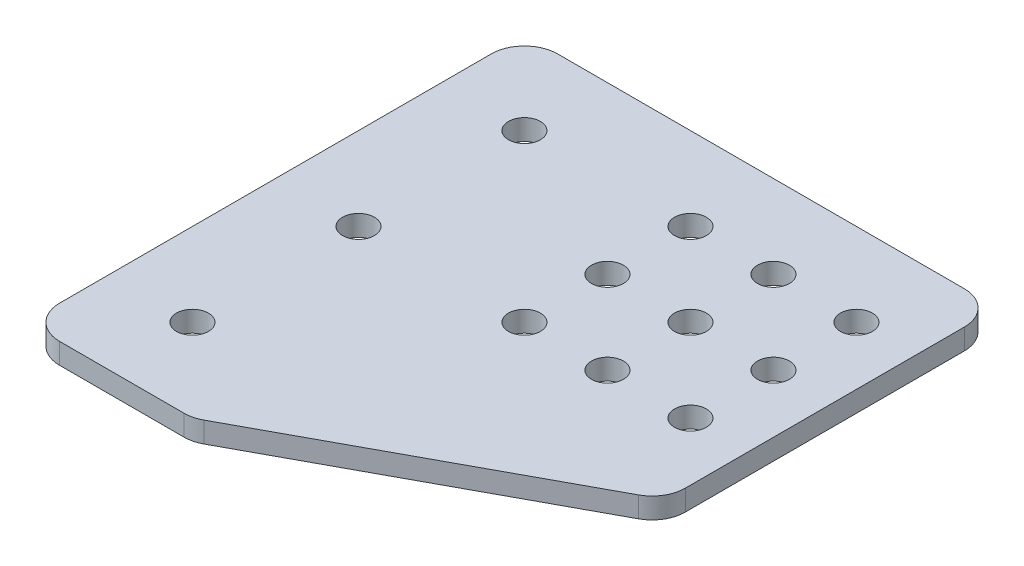
ISO-10303-21;
HEADER;
FILE_DESCRIPTION(('STEP AP214'),'2;1');
FILE_NAME('part.step','',(''),(''),'','','');
FILE_SCHEMA(('AUTOMOTIVE_DESIGN { 1 0 10303 214 1 1 1 1 }'));
ENDSEC;
DATA;
#1=APPLICATION_CONTEXT('core data for automotive mechanical design processes');
#2=APPLICATION_PROTOCOL_DEFINITION('international standard','automotive_design',2000,#1);
#3=PRODUCT_CONTEXT('',#1,'mechanical');
#4=PRODUCT('Part','Part','',(#3));
#5=PRODUCT_RELATED_PRODUCT_CATEGORY('part','',(#4));
#6=PRODUCT_DEFINITION_FORMATION('','',#4);
#7=PRODUCT_DEFINITION_CONTEXT('part definition',#1,'design');
#8=PRODUCT_DEFINITION('design','',#6,#7);
#9=PRODUCT_DEFINITION_SHAPE('','',#8);
#10=(LENGTH_UNIT() NAMED_UNIT(*) SI_UNIT(.MILLI.,.METRE.));
#11=(NAMED_UNIT(*) PLANE_ANGLE_UNIT() SI_UNIT($,.RADIAN.));
#12=(NAMED_UNIT(*) SI_UNIT($,.STERADIAN.) SOLID_ANGLE_UNIT());
#13=UNCERTAINTY_MEASURE_WITH_UNIT(LENGTH_MEASURE(1.E-05),#10,'distance_accuracy_value','');
#14=(GEOMETRIC_REPRESENTATION_CONTEXT(3) GLOBAL_UNCERTAINTY_ASSIGNED_CONTEXT((#13)) GLOBAL_UNIT_ASSIGNED_CONTEXT((#10,
#11,#12)) REPRESENTATION_CONTEXT('',''));
#15=CARTESIAN_POINT('',(0.,0.,0.));
#16=DIRECTION('',(0.,0.,1.));
#17=DIRECTION('',(1.,0.,0.));
#18=AXIS2_PLACEMENT_3D('',#15,#16,#17);
#19=CARTESIAN_POINT('',(0.,3.175,0.));
#20=DIRECTION('',(1.,0.,0.));
#21=DIRECTION('',(0.,0.,-1.));
#22=AXIS2_PLACEMENT_3D('',#19,#20,#21);
#23=PLANE('',#22);
#24=DIRECTION('',(0.,0.,1.));
#25=VECTOR('',#24,1.);
#26=CARTESIAN_POINT('',(0.,0.,0.));
#27=LINE('',#26,#25);
#28=CARTESIAN_POINT('',(0.,0.,5.08000000000004));
#29=VERTEX_POINT('',#28);
#30=CARTESIAN_POINT('',(0.,0.,71.12));
#31=VERTEX_POINT('',#30);
#32=EDGE_CURVE('E146',#29,#31,#27,.T.);
#33=ORIENTED_EDGE('',*,*,#32,.T.);
#34=DIRECTION('',(0.,-1.,0.));
#35=VECTOR('',#34,1.);
#36=CARTESIAN_POINT('',(0.,3.175,71.12));
#37=LINE('',#36,#35);
#38=CARTESIAN_POINT('',(0.,3.175,71.12));
#39=VERTEX_POINT('',#38);
#40=EDGE_CURVE('E124',#39,#31,#37,.T.);
#41=ORIENTED_EDGE('',*,*,#40,.F.);
#42=DIRECTION('',(0.,0.,1.));
#43=VECTOR('',#42,1.);
#44=CARTESIAN_POINT('',(0.,3.175,0.));
#45=LINE('',#44,#43);
#46=CARTESIAN_POINT('',(0.,3.175,5.08000000000004));
#47=VERTEX_POINT('',#46);
#48=EDGE_CURVE('E132',#47,#39,#45,.T.);
#49=ORIENTED_EDGE('',*,*,#48,.F.);
#50=DIRECTION('',(0.,-1.,0.));
#51=VECTOR('',#50,1.);
#52=CARTESIAN_POINT('',(0.,3.175,5.08000000000004));
#53=LINE('',#52,#51);
#54=EDGE_CURVE('E258',#47,#29,#53,.T.);
#55=ORIENTED_EDGE('',*,*,#54,.T.);
#56=EDGE_LOOP('',(#33,#41,#49,#55));
#57=FACE_BOUND('',#56,.T.);
#58=ADVANCED_FACE('F41',(#57),#23,.F.);
#59=CARTESIAN_POINT('',(5.08,3.175,71.12));
#60=DIRECTION('',(0.,-1.,0.));
#61=DIRECTION('',(0.,0.,-1.));
#62=AXIS2_PLACEMENT_3D('',#59,#60,#61);
#63=CYLINDRICAL_SURFACE('',#62,5.08);
#64=CARTESIAN_POINT('',(5.08,0.,71.12));
#65=DIRECTION('',(0.,1.,0.));
#66=DIRECTION('',(0.,0.,1.));
#67=AXIS2_PLACEMENT_3D('',#64,#65,#66);
#68=CIRCLE('',#67,5.08);
#69=CARTESIAN_POINT('',(5.08000000000004,0.,76.2));
#70=VERTEX_POINT('',#69);
#71=EDGE_CURVE('E332',#31,#70,#68,.T.);
#72=ORIENTED_EDGE('',*,*,#71,.T.);
#73=DIRECTION('',(0.,-1.,0.));
#74=VECTOR('',#73,1.);
#75=CARTESIAN_POINT('',(5.08000000000004,3.175,76.2));
#76=LINE('',#75,#74);
#77=CARTESIAN_POINT('',(5.08000000000004,3.175,76.2));
#78=VERTEX_POINT('',#77);
#79=EDGE_CURVE('E127',#78,#70,#76,.T.);
#80=ORIENTED_EDGE('',*,*,#79,.F.);
#81=CARTESIAN_POINT('',(5.08,3.175,71.12));
#82=DIRECTION('',(0.,1.,0.));
#83=DIRECTION('',(0.,0.,1.));
#84=AXIS2_PLACEMENT_3D('',#81,#82,#83);
#85=CIRCLE('',#84,5.08);
#86=EDGE_CURVE('E120',#39,#78,#85,.T.);
#87=ORIENTED_EDGE('',*,*,#86,.F.);
#88=ORIENTED_EDGE('',*,*,#40,.T.);
#89=EDGE_LOOP('',(#72,#80,#87,#88));
#90=FACE_BOUND('',#89,.T.);
#91=ADVANCED_FACE('F122',(#90),#63,.T.);
#92=CARTESIAN_POINT('',(0.,3.175,76.2));
#93=DIRECTION('',(0.,0.,-1.));
#94=DIRECTION('',(-1.,0.,0.));
#95=AXIS2_PLACEMENT_3D('',#92,#93,#94);
#96=PLANE('',#95);
#97=DIRECTION('',(1.,0.,0.));
#98=VECTOR('',#97,1.);
#99=CARTESIAN_POINT('',(0.,0.,76.2));
#100=LINE('',#99,#98);
#101=CARTESIAN_POINT('',(24.114891650835,0.,76.2));
#102=VERTEX_POINT('',#101);
#103=EDGE_CURVE('E208',#70,#102,#100,.T.);
#104=ORIENTED_EDGE('',*,*,#103,.T.);
#105=DIRECTION('',(0.,-1.,0.));
#106=VECTOR('',#105,1.);
#107=CARTESIAN_POINT('',(24.114891650835,3.175,76.2));
#108=LINE('',#107,#106);
#109=CARTESIAN_POINT('',(24.114891650835,3.175,76.2));
#110=VERTEX_POINT('',#109);
#111=EDGE_CURVE('E170',#102,#110,#108,.F.);
#112=ORIENTED_EDGE('',*,*,#111,.T.);
#113=DIRECTION('',(1.,0.,0.));
#114=VECTOR('',#113,1.);
#115=CARTESIAN_POINT('',(0.,3.175,76.2));
#116=LINE('',#115,#114);
#117=EDGE_CURVE('E131',#78,#110,#116,.T.);
#118=ORIENTED_EDGE('',*,*,#117,.F.);
#119=ORIENTED_EDGE('',*,*,#79,.T.);
#120=EDGE_LOOP('',(#104,#112,#118,#119));
#121=FACE_BOUND('',#120,.T.);
#122=ADVANCED_FACE('F339',(#121),#96,.F.);
#123=CARTESIAN_POINT('',(37.6189937817976,3.175,69.5951384963256));
#124=DIRECTION('',(-0.475517034365474,0.,-0.879706513576127));
#125=DIRECTION('',(-0.879706513576127,0.,0.475517034365474));
#126=AXIS2_PLACEMENT_3D('',#123,#124,#125);
#127=PLANE('',#126);
#128=DIRECTION('',(0.879706513576127,0.,-0.475517034365474));
#129=VECTOR('',#128,1.);
#130=CARTESIAN_POINT('',(37.6189937817976,3.175,69.5951384963256));
#131=LINE('',#130,#129);
#132=CARTESIAN_POINT('',(26.5305181854116,3.175,75.5889090889667));
#133=VERTEX_POINT('',#132);
#134=CARTESIAN_POINT('',(69.7256265345766,3.175,52.2402018732018));
#135=VERTEX_POINT('',#134);
#136=EDGE_CURVE('E273',#133,#135,#131,.T.);
#137=ORIENTED_EDGE('',*,*,#136,.F.);
#138=DIRECTION('',(0.,-1.,0.));
#139=VECTOR('',#138,1.);
#140=CARTESIAN_POINT('',(26.5305181854116,3.175,75.5889090889667));
#141=LINE('',#140,#139);
#142=CARTESIAN_POINT('',(26.5305181854116,0.,75.5889090889667));
#143=VERTEX_POINT('',#142);
#144=EDGE_CURVE('E152',#133,#143,#141,.T.);
#145=ORIENTED_EDGE('',*,*,#144,.T.);
#146=DIRECTION('',(0.879706513576127,0.,-0.475517034365474));
#147=VECTOR('',#146,1.);
#148=CARTESIAN_POINT('',(37.6189937817976,0.,69.5951384963256));
#149=LINE('',#148,#147);
#150=CARTESIAN_POINT('',(69.7256265345766,0.,52.2402018732018));
#151=VERTEX_POINT('',#150);
#152=EDGE_CURVE('E202',#143,#151,#149,.T.);
#153=ORIENTED_EDGE('',*,*,#152,.T.);
#154=DIRECTION('',(0.,-1.,0.));
#155=VECTOR('',#154,1.);
#156=CARTESIAN_POINT('',(69.7256265345766,3.175,52.2402018732018));
#157=LINE('',#156,#155);
#158=EDGE_CURVE('E148',#151,#135,#157,.F.);
#159=ORIENTED_EDGE('',*,*,#158,.T.);
#160=EDGE_LOOP('',(#137,#145,#153,#159));
#161=FACE_BOUND('',#160,.T.);
#162=ADVANCED_FACE('F346',(#161),#127,.F.);
#163=CARTESIAN_POINT('',(72.39,3.175,0.));
#164=DIRECTION('',(1.,0.,0.));
#165=DIRECTION('',(0.,0.,-1.));
#166=AXIS2_PLACEMENT_3D('',#163,#164,#165);
#167=PLANE('',#166);
#168=DIRECTION('',(0.,0.,1.));
#169=VECTOR('',#168,1.);
#170=CARTESIAN_POINT('',(72.39,0.,0.));
#171=LINE('',#170,#169);
#172=CARTESIAN_POINT('',(72.39,0.,5.08));
#173=VERTEX_POINT('',#172);
#174=CARTESIAN_POINT('',(72.39,0.,47.7712927842351));
#175=VERTEX_POINT('',#174);
#176=EDGE_CURVE('E190',#173,#175,#171,.T.);
#177=ORIENTED_EDGE('',*,*,#176,.F.);
#178=DIRECTION('',(0.,-1.,0.));
#179=VECTOR('',#178,1.);
#180=CARTESIAN_POINT('',(72.39,3.175,5.08));
#181=LINE('',#180,#179);
#182=CARTESIAN_POINT('',(72.39,3.175,5.08));
#183=VERTEX_POINT('',#182);
#184=EDGE_CURVE('E11',#173,#183,#181,.F.);
#185=ORIENTED_EDGE('',*,*,#184,.T.);
#186=DIRECTION('',(0.,0.,1.));
#187=VECTOR('',#186,1.);
#188=CARTESIAN_POINT('',(72.39,3.175,0.));
#189=LINE('',#188,#187);
#190=CARTESIAN_POINT('',(72.39,3.175,47.7712927842351));
#191=VERTEX_POINT('',#190);
#192=EDGE_CURVE('E192',#183,#191,#189,.T.);
#193=ORIENTED_EDGE('',*,*,#192,.T.);
#194=DIRECTION('',(0.,-1.,0.));
#195=VECTOR('',#194,1.);
#196=CARTESIAN_POINT('',(72.39,0.,47.7712927842351));
#197=LINE('',#196,#195);
#198=EDGE_CURVE('E50',#191,#175,#197,.T.);
#199=ORIENTED_EDGE('',*,*,#198,.T.);
#200=EDGE_LOOP('',(#177,#185,#193,#199));
#201=FACE_BOUND('',#200,.T.);
#202=ADVANCED_FACE('F189',(#201),#167,.T.);
#203=CARTESIAN_POINT('',(0.,3.175,0.));
#204=DIRECTION('',(0.,0.,-1.));
#205=DIRECTION('',(-1.,0.,0.));
#206=AXIS2_PLACEMENT_3D('',#203,#204,#205);
#207=PLANE('',#206);
#208=DIRECTION('',(1.,0.,0.));
#209=VECTOR('',#208,1.);
#210=CARTESIAN_POINT('',(0.,3.175,0.));
#211=LINE('',#210,#209);
#212=CARTESIAN_POINT('',(5.08000000000004,3.175,0.));
#213=VERTEX_POINT('',#212);
#214=CARTESIAN_POINT('',(67.31,3.175,0.));
#215=VERTEX_POINT('',#214);
#216=EDGE_CURVE('E269',#213,#215,#211,.T.);
#217=ORIENTED_EDGE('',*,*,#216,.T.);
#218=DIRECTION('',(0.,-1.,0.));
#219=VECTOR('',#218,1.);
#220=CARTESIAN_POINT('',(67.31,3.175,0.));
#221=LINE('',#220,#219);
#222=CARTESIAN_POINT('',(67.31,0.,0.));
#223=VERTEX_POINT('',#222);
#224=EDGE_CURVE('E180',#215,#223,#221,.T.);
#225=ORIENTED_EDGE('',*,*,#224,.T.);
#226=DIRECTION('',(1.,0.,0.));
#227=VECTOR('',#226,1.);
#228=CARTESIAN_POINT('',(0.,0.,0.));
#229=LINE('',#228,#227);
#230=CARTESIAN_POINT('',(5.08000000000004,0.,0.));
#231=VERTEX_POINT('',#230);
#232=EDGE_CURVE('E201',#231,#223,#229,.T.);
#233=ORIENTED_EDGE('',*,*,#232,.F.);
#234=DIRECTION('',(0.,-1.,0.));
#235=VECTOR('',#234,1.);
#236=CARTESIAN_POINT('',(5.08000000000004,3.175,0.));
#237=LINE('',#236,#235);
#238=EDGE_CURVE('E154',#213,#231,#237,.T.);
#239=ORIENTED_EDGE('',*,*,#238,.F.);
#240=EDGE_LOOP('',(#217,#225,#233,#239));
#241=FACE_BOUND('',#240,.T.);
#242=ADVANCED_FACE('F267',(#241),#207,.T.);
#243=CARTESIAN_POINT('',(63.5,3.175,38.1));
#244=DIRECTION('',(0.,-1.,0.));
#245=DIRECTION('',(0.,0.,-1.));
#246=AXIS2_PLACEMENT_3D('',#243,#244,#245);
#247=CYLINDRICAL_SURFACE('',#246,2.4384);
#248=CARTESIAN_POINT('',(63.5,3.175,38.1));
#249=DIRECTION('',(0.,1.,0.));
#250=DIRECTION('',(0.,0.,1.));
#251=AXIS2_PLACEMENT_3D('',#248,#249,#250);
#252=CIRCLE('',#251,2.4384);
#253=CARTESIAN_POINT('',(63.5,3.175,40.5384));
#254=VERTEX_POINT('',#253);
#255=EDGE_CURVE('E319',#254,#254,#252,.T.);
#256=ORIENTED_EDGE('',*,*,#255,.T.);
#257=EDGE_LOOP('',(#256));
#258=FACE_BOUND('',#257,.T.);
#259=CARTESIAN_POINT('',(63.5,0.,38.1));
#260=DIRECTION('',(0.,1.,0.));
#261=DIRECTION('',(0.,0.,1.));
#262=AXIS2_PLACEMENT_3D('',#259,#260,#261);
#263=CIRCLE('',#262,2.4384);
#264=CARTESIAN_POINT('',(63.5,0.,40.5384));
#265=VERTEX_POINT('',#264);
#266=EDGE_CURVE('E250',#265,#265,#263,.T.);
#267=ORIENTED_EDGE('',*,*,#266,.F.);
#268=EDGE_LOOP('',(#267));
#269=FACE_BOUND('',#268,.T.);
#270=ADVANCED_FACE('F380',(#258,#269),#247,.F.);
#271=CARTESIAN_POINT('',(63.5,3.175,12.7));
#272=DIRECTION('',(0.,-1.,0.));
#273=DIRECTION('',(0.,0.,-1.));
#274=AXIS2_PLACEMENT_3D('',#271,#272,#273);
#275=CYLINDRICAL_SURFACE('',#274,2.4384);
#276=CARTESIAN_POINT('',(63.5,3.175,12.7));
#277=DIRECTION('',(0.,1.,0.));
#278=DIRECTION('',(0.,0.,1.));
#279=AXIS2_PLACEMENT_3D('',#276,#277,#278);
#280=CIRCLE('',#279,2.4384);
#281=CARTESIAN_POINT('',(63.5,3.175,15.1384));
#282=VERTEX_POINT('',#281);
#283=EDGE_CURVE('E315',#282,#282,#280,.T.);
#284=ORIENTED_EDGE('',*,*,#283,.T.);
#285=EDGE_LOOP('',(#284));
#286=FACE_BOUND('',#285,.T.);
#287=CARTESIAN_POINT('',(63.5,0.,12.7));
#288=DIRECTION('',(0.,1.,0.));
#289=DIRECTION('',(0.,0.,1.));
#290=AXIS2_PLACEMENT_3D('',#287,#288,#289);
#291=CIRCLE('',#290,2.4384);
#292=CARTESIAN_POINT('',(63.5,0.,15.1384));
#293=VERTEX_POINT('',#292);
#294=EDGE_CURVE('E246',#293,#293,#291,.T.);
#295=ORIENTED_EDGE('',*,*,#294,.F.);
#296=EDGE_LOOP('',(#295));
#297=FACE_BOUND('',#296,.T.);
#298=ADVANCED_FACE('F383',(#286,#297),#275,.F.);
#299=CARTESIAN_POINT('',(63.5,3.175,25.4));
#300=DIRECTION('',(0.,-1.,0.));
#301=DIRECTION('',(0.,0.,-1.));
#302=AXIS2_PLACEMENT_3D('',#299,#300,#301);
#303=CYLINDRICAL_SURFACE('',#302,2.4384);
#304=CARTESIAN_POINT('',(63.5,3.175,25.4));
#305=DIRECTION('',(0.,1.,0.));
#306=DIRECTION('',(0.,0.,1.));
#307=AXIS2_PLACEMENT_3D('',#304,#305,#306);
#308=CIRCLE('',#307,2.4384);
#309=CARTESIAN_POINT('',(63.5,3.175,27.8384));
#310=VERTEX_POINT('',#309);
#311=EDGE_CURVE('E311',#310,#310,#308,.T.);
#312=ORIENTED_EDGE('',*,*,#311,.T.);
#313=EDGE_LOOP('',(#312));
#314=FACE_BOUND('',#313,.T.);
#315=CARTESIAN_POINT('',(63.5,0.,25.4));
#316=DIRECTION('',(0.,1.,0.));
#317=DIRECTION('',(0.,0.,1.));
#318=AXIS2_PLACEMENT_3D('',#315,#316,#317);
#319=CIRCLE('',#318,2.4384);
#320=CARTESIAN_POINT('',(63.5,0.,27.8384));
#321=VERTEX_POINT('',#320);
#322=EDGE_CURVE('E242',#321,#321,#319,.T.);
#323=ORIENTED_EDGE('',*,*,#322,.F.);
#324=EDGE_LOOP('',(#323));
#325=FACE_BOUND('',#324,.T.);
#326=ADVANCED_FACE('F387',(#314,#325),#303,.F.);
#327=CARTESIAN_POINT('',(38.1,3.175,12.7));
#328=DIRECTION('',(0.,-1.,0.));
#329=DIRECTION('',(0.,0.,-1.));
#330=AXIS2_PLACEMENT_3D('',#327,#328,#329);
#331=CYLINDRICAL_SURFACE('',#330,2.4384);
#332=CARTESIAN_POINT('',(38.1,3.175,12.7));
#333=DIRECTION('',(0.,1.,0.));
#334=DIRECTION('',(0.,0.,1.));
#335=AXIS2_PLACEMENT_3D('',#332,#333,#334);
#336=CIRCLE('',#335,2.4384);
#337=CARTESIAN_POINT('',(38.1,3.175,15.1384));
#338=VERTEX_POINT('',#337);
#339=EDGE_CURVE('E307',#338,#338,#336,.T.);
#340=ORIENTED_EDGE('',*,*,#339,.T.);
#341=EDGE_LOOP('',(#340));
#342=FACE_BOUND('',#341,.T.);
#343=CARTESIAN_POINT('',(38.1,0.,12.7));
#344=DIRECTION('',(0.,1.,0.));
#345=DIRECTION('',(0.,0.,1.));
#346=AXIS2_PLACEMENT_3D('',#343,#344,#345);
#347=CIRCLE('',#346,2.4384);
#348=CARTESIAN_POINT('',(38.1,0.,15.1384));
#349=VERTEX_POINT('',#348);
#350=EDGE_CURVE('E238',#349,#349,#347,.T.);
#351=ORIENTED_EDGE('',*,*,#350,.F.);
#352=EDGE_LOOP('',(#351));
#353=FACE_BOUND('',#352,.T.);
#354=ADVANCED_FACE('F391',(#342,#353),#331,.F.);
#355=CARTESIAN_POINT('',(38.1,3.175,25.4));
#356=DIRECTION('',(0.,-1.,0.));
#357=DIRECTION('',(0.,0.,-1.));
#358=AXIS2_PLACEMENT_3D('',#355,#356,#357);
#359=CYLINDRICAL_SURFACE('',#358,2.4384);
#360=CARTESIAN_POINT('',(38.1,3.175,25.4));
#361=DIRECTION('',(0.,1.,0.));
#362=DIRECTION('',(0.,0.,1.));
#363=AXIS2_PLACEMENT_3D('',#360,#361,#362);
#364=CIRCLE('',#363,2.4384);
#365=CARTESIAN_POINT('',(38.1,3.175,27.8384));
#366=VERTEX_POINT('',#365);
#367=EDGE_CURVE('E303',#366,#366,#364,.T.);
#368=ORIENTED_EDGE('',*,*,#367,.T.);
#369=EDGE_LOOP('',(#368));
#370=FACE_BOUND('',#369,.T.);
#371=CARTESIAN_POINT('',(38.1,0.,25.4));
#372=DIRECTION('',(0.,1.,0.));
#373=DIRECTION('',(0.,0.,1.));
#374=AXIS2_PLACEMENT_3D('',#371,#372,#373);
#375=CIRCLE('',#374,2.4384);
#376=CARTESIAN_POINT('',(38.1,0.,27.8384));
#377=VERTEX_POINT('',#376);
#378=EDGE_CURVE('E234',#377,#377,#375,.T.);
#379=ORIENTED_EDGE('',*,*,#378,.F.);
#380=EDGE_LOOP('',(#379));
#381=FACE_BOUND('',#380,.T.);
#382=ADVANCED_FACE('F395',(#370,#381),#359,.F.);
#383=CARTESIAN_POINT('',(38.1,3.175,38.1));
#384=DIRECTION('',(0.,-1.,0.));
#385=DIRECTION('',(0.,0.,-1.));
#386=AXIS2_PLACEMENT_3D('',#383,#384,#385);
#387=CYLINDRICAL_SURFACE('',#386,2.4384);
#388=CARTESIAN_POINT('',(38.1,3.175,38.1));
#389=DIRECTION('',(0.,1.,0.));
#390=DIRECTION('',(0.,0.,1.));
#391=AXIS2_PLACEMENT_3D('',#388,#389,#390);
#392=CIRCLE('',#391,2.4384);
#393=CARTESIAN_POINT('',(38.1,3.175,40.5384));
#394=VERTEX_POINT('',#393);
#395=EDGE_CURVE('E299',#394,#394,#392,.T.);
#396=ORIENTED_EDGE('',*,*,#395,.T.);
#397=EDGE_LOOP('',(#396));
#398=FACE_BOUND('',#397,.T.);
#399=CARTESIAN_POINT('',(38.1,0.,38.1));
#400=DIRECTION('',(0.,1.,0.));
#401=DIRECTION('',(0.,0.,1.));
#402=AXIS2_PLACEMENT_3D('',#399,#400,#401);
#403=CIRCLE('',#402,2.4384);
#404=CARTESIAN_POINT('',(38.1,0.,40.5384));
#405=VERTEX_POINT('',#404);
#406=EDGE_CURVE('E230',#405,#405,#403,.T.);
#407=ORIENTED_EDGE('',*,*,#406,.F.);
#408=EDGE_LOOP('',(#407));
#409=FACE_BOUND('',#408,.T.);
#410=ADVANCED_FACE('F399',(#398,#409),#387,.F.);
#411=CARTESIAN_POINT('',(12.7,3.175,12.7));
#412=DIRECTION('',(0.,-1.,0.));
#413=DIRECTION('',(0.,0.,-1.));
#414=AXIS2_PLACEMENT_3D('',#411,#412,#413);
#415=CYLINDRICAL_SURFACE('',#414,2.4384);
#416=CARTESIAN_POINT('',(12.7,3.175,12.7));
#417=DIRECTION('',(0.,1.,0.));
#418=DIRECTION('',(0.,0.,1.));
#419=AXIS2_PLACEMENT_3D('',#416,#417,#418);
#420=CIRCLE('',#419,2.4384);
#421=CARTESIAN_POINT('',(12.7,3.175,15.1384));
#422=VERTEX_POINT('',#421);
#423=EDGE_CURVE('E295',#422,#422,#420,.T.);
#424=ORIENTED_EDGE('',*,*,#423,.T.);
#425=EDGE_LOOP('',(#424));
#426=FACE_BOUND('',#425,.T.);
#427=CARTESIAN_POINT('',(12.7,0.,12.7));
#428=DIRECTION('',(0.,1.,0.));
#429=DIRECTION('',(0.,0.,1.));
#430=AXIS2_PLACEMENT_3D('',#427,#428,#429);
#431=CIRCLE('',#430,2.4384);
#432=CARTESIAN_POINT('',(12.7,0.,15.1384));
#433=VERTEX_POINT('',#432);
#434=EDGE_CURVE('E226',#433,#433,#431,.T.);
#435=ORIENTED_EDGE('',*,*,#434,.F.);
#436=EDGE_LOOP('',(#435));
#437=FACE_BOUND('',#436,.T.);
#438=ADVANCED_FACE('F403',(#426,#437),#415,.F.);
#439=CARTESIAN_POINT('',(12.7,3.175,38.1));
#440=DIRECTION('',(0.,-1.,0.));
#441=DIRECTION('',(0.,0.,-1.));
#442=AXIS2_PLACEMENT_3D('',#439,#440,#441);
#443=CYLINDRICAL_SURFACE('',#442,2.4384);
#444=CARTESIAN_POINT('',(12.7,3.175,38.1));
#445=DIRECTION('',(0.,1.,0.));
#446=DIRECTION('',(0.,0.,1.));
#447=AXIS2_PLACEMENT_3D('',#444,#445,#446);
#448=CIRCLE('',#447,2.4384);
#449=CARTESIAN_POINT('',(12.7,3.175,40.5384));
#450=VERTEX_POINT('',#449);
#451=EDGE_CURVE('E291',#450,#450,#448,.T.);
#452=ORIENTED_EDGE('',*,*,#451,.T.);
#453=EDGE_LOOP('',(#452));
#454=FACE_BOUND('',#453,.T.);
#455=CARTESIAN_POINT('',(12.7,0.,38.1));
#456=DIRECTION('',(0.,1.,0.));
#457=DIRECTION('',(0.,0.,1.));
#458=AXIS2_PLACEMENT_3D('',#455,#456,#457);
#459=CIRCLE('',#458,2.4384);
#460=CARTESIAN_POINT('',(12.7,0.,40.5384));
#461=VERTEX_POINT('',#460);
#462=EDGE_CURVE('E222',#461,#461,#459,.T.);
#463=ORIENTED_EDGE('',*,*,#462,.F.);
#464=EDGE_LOOP('',(#463));
#465=FACE_BOUND('',#464,.T.);
#466=ADVANCED_FACE('F407',(#454,#465),#443,.F.);
#467=CARTESIAN_POINT('',(50.8,3.175,25.4));
#468=DIRECTION('',(0.,-1.,0.));
#469=DIRECTION('',(0.,0.,-1.));
#470=AXIS2_PLACEMENT_3D('',#467,#468,#469);
#471=CYLINDRICAL_SURFACE('',#470,2.4384);
#472=CARTESIAN_POINT('',(50.8,3.175,25.4));
#473=DIRECTION('',(0.,1.,0.));
#474=DIRECTION('',(0.,0.,1.));
#475=AXIS2_PLACEMENT_3D('',#472,#473,#474);
#476=CIRCLE('',#475,2.4384);
#477=CARTESIAN_POINT('',(50.8,3.175,27.8384));
#478=VERTEX_POINT('',#477);
#479=EDGE_CURVE('E287',#478,#478,#476,.T.);
#480=ORIENTED_EDGE('',*,*,#479,.T.);
#481=EDGE_LOOP('',(#480));
#482=FACE_BOUND('',#481,.T.);
#483=CARTESIAN_POINT('',(50.8,0.,25.4));
#484=DIRECTION('',(0.,1.,0.));
#485=DIRECTION('',(0.,0.,1.));
#486=AXIS2_PLACEMENT_3D('',#483,#484,#485);
#487=CIRCLE('',#486,2.4384);
#488=CARTESIAN_POINT('',(50.8,0.,27.8384));
#489=VERTEX_POINT('',#488);
#490=EDGE_CURVE('E218',#489,#489,#487,.T.);
#491=ORIENTED_EDGE('',*,*,#490,.F.);
#492=EDGE_LOOP('',(#491));
#493=FACE_BOUND('',#492,.T.);
#494=ADVANCED_FACE('F411',(#482,#493),#471,.F.);
#495=CARTESIAN_POINT('',(50.8,3.175,38.1));
#496=DIRECTION('',(0.,-1.,0.));
#497=DIRECTION('',(0.,0.,-1.));
#498=AXIS2_PLACEMENT_3D('',#495,#496,#497);
#499=CYLINDRICAL_SURFACE('',#498,2.4384);
#500=CARTESIAN_POINT('',(50.8,3.175,38.1));
#501=DIRECTION('',(0.,1.,0.));
#502=DIRECTION('',(0.,0.,1.));
#503=AXIS2_PLACEMENT_3D('',#500,#501,#502);
#504=CIRCLE('',#503,2.4384);
#505=CARTESIAN_POINT('',(50.8,3.175,40.5384));
#506=VERTEX_POINT('',#505);
#507=EDGE_CURVE('E283',#506,#506,#504,.T.);
#508=ORIENTED_EDGE('',*,*,#507,.T.);
#509=EDGE_LOOP('',(#508));
#510=FACE_BOUND('',#509,.T.);
#511=CARTESIAN_POINT('',(50.8,0.,38.1));
#512=DIRECTION('',(0.,1.,0.));
#513=DIRECTION('',(0.,0.,1.));
#514=AXIS2_PLACEMENT_3D('',#511,#512,#513);
#515=CIRCLE('',#514,2.4384);
#516=CARTESIAN_POINT('',(50.8,0.,40.5384));
#517=VERTEX_POINT('',#516);
#518=EDGE_CURVE('E214',#517,#517,#515,.T.);
#519=ORIENTED_EDGE('',*,*,#518,.F.);
#520=EDGE_LOOP('',(#519));
#521=FACE_BOUND('',#520,.T.);
#522=ADVANCED_FACE('F415',(#510,#521),#499,.F.);
#523=CARTESIAN_POINT('',(5.08,3.175,5.08));
#524=DIRECTION('',(0.,-1.,0.));
#525=DIRECTION('',(0.,0.,-1.));
#526=AXIS2_PLACEMENT_3D('',#523,#524,#525);
#527=CYLINDRICAL_SURFACE('',#526,5.08);
#528=CARTESIAN_POINT('',(5.08,0.,5.08));
#529=DIRECTION('',(0.,1.,0.));
#530=DIRECTION('',(0.,0.,1.));
#531=AXIS2_PLACEMENT_3D('',#528,#529,#530);
#532=CIRCLE('',#531,5.08);
#533=EDGE_CURVE('E206',#231,#29,#532,.T.);
#534=ORIENTED_EDGE('',*,*,#533,.T.);
#535=ORIENTED_EDGE('',*,*,#54,.F.);
#536=CARTESIAN_POINT('',(5.08,3.175,5.08));
#537=DIRECTION('',(0.,1.,0.));
#538=DIRECTION('',(0.,0.,1.));
#539=AXIS2_PLACEMENT_3D('',#536,#537,#538);
#540=CIRCLE('',#539,5.08);
#541=EDGE_CURVE('E138',#213,#47,#540,.T.);
#542=ORIENTED_EDGE('',*,*,#541,.F.);
#543=ORIENTED_EDGE('',*,*,#238,.T.);
#544=EDGE_LOOP('',(#534,#535,#542,#543));
#545=FACE_BOUND('',#544,.T.);
#546=ADVANCED_FACE('F264',(#545),#527,.T.);
#547=CARTESIAN_POINT('',(50.8,3.175,12.7));
#548=DIRECTION('',(0.,-1.,0.));
#549=DIRECTION('',(0.,0.,-1.));
#550=AXIS2_PLACEMENT_3D('',#547,#548,#549);
#551=CYLINDRICAL_SURFACE('',#550,2.4384);
#552=CARTESIAN_POINT('',(50.8,3.175,12.7));
#553=DIRECTION('',(0.,1.,0.));
#554=DIRECTION('',(0.,0.,1.));
#555=AXIS2_PLACEMENT_3D('',#552,#553,#554);
#556=CIRCLE('',#555,2.4384);
#557=CARTESIAN_POINT('',(50.8,3.175,15.1384));
#558=VERTEX_POINT('',#557);
#559=EDGE_CURVE('E143',#558,#558,#556,.T.);
#560=ORIENTED_EDGE('',*,*,#559,.T.);
#561=EDGE_LOOP('',(#560));
#562=FACE_BOUND('',#561,.T.);
#563=CARTESIAN_POINT('',(50.8,0.,12.7));
#564=DIRECTION('',(0.,1.,0.));
#565=DIRECTION('',(0.,0.,1.));
#566=AXIS2_PLACEMENT_3D('',#563,#564,#565);
#567=CIRCLE('',#566,2.4384);
#568=CARTESIAN_POINT('',(50.8,0.,15.1384));
#569=VERTEX_POINT('',#568);
#570=EDGE_CURVE('E326',#569,#569,#567,.T.);
#571=ORIENTED_EDGE('',*,*,#570,.F.);
#572=EDGE_LOOP('',(#571));
#573=FACE_BOUND('',#572,.T.);
#574=ADVANCED_FACE('F360',(#562,#573),#551,.F.);
#575=CARTESIAN_POINT('',(12.7,3.175,63.5));
#576=DIRECTION('',(0.,-1.,0.));
#577=DIRECTION('',(0.,0.,-1.));
#578=AXIS2_PLACEMENT_3D('',#575,#576,#577);
#579=CYLINDRICAL_SURFACE('',#578,2.4384);
#580=CARTESIAN_POINT('',(12.7,3.175,63.5));
#581=DIRECTION('',(0.,1.,0.));
#582=DIRECTION('',(0.,0.,1.));
#583=AXIS2_PLACEMENT_3D('',#580,#581,#582);
#584=CIRCLE('',#583,2.4384);
#585=CARTESIAN_POINT('',(12.7,3.175,65.9384));
#586=VERTEX_POINT('',#585);
#587=EDGE_CURVE('E260',#586,#586,#584,.F.);
#588=ORIENTED_EDGE('',*,*,#587,.F.);
#589=EDGE_LOOP('',(#588));
#590=FACE_BOUND('',#589,.T.);
#591=CARTESIAN_POINT('',(12.7,0.,63.5));
#592=DIRECTION('',(0.,1.,0.));
#593=DIRECTION('',(0.,0.,1.));
#594=AXIS2_PLACEMENT_3D('',#591,#592,#593);
#595=CIRCLE('',#594,2.4384);
#596=CARTESIAN_POINT('',(12.7,0.,65.9384));
#597=VERTEX_POINT('',#596);
#598=EDGE_CURVE('E254',#597,#597,#595,.F.);
#599=ORIENTED_EDGE('',*,*,#598,.T.);
#600=EDGE_LOOP('',(#599));
#601=FACE_BOUND('',#600,.T.);
#602=ADVANCED_FACE('F363',(#590,#601),#579,.F.);
#603=CARTESIAN_POINT('',(0.,3.175,0.));
#604=DIRECTION('',(0.,1.,0.));
#605=DIRECTION('',(0.,0.,1.));
#606=AXIS2_PLACEMENT_3D('',#603,#604,#605);
#607=PLANE('',#606);
#608=ORIENTED_EDGE('',*,*,#559,.F.);
#609=EDGE_LOOP('',(#608));
#610=FACE_BOUND('',#609,.T.);
#611=ORIENTED_EDGE('',*,*,#117,.T.);
#612=CARTESIAN_POINT('',(24.114891650835,3.175,71.12));
#613=DIRECTION('',(0.,1.,0.));
#614=DIRECTION('',(0.,0.,1.));
#615=AXIS2_PLACEMENT_3D('',#612,#613,#614);
#616=CIRCLE('',#615,5.08);
#617=EDGE_CURVE('E177',#110,#133,#616,.T.);
#618=ORIENTED_EDGE('',*,*,#617,.T.);
#619=ORIENTED_EDGE('',*,*,#136,.T.);
#620=CARTESIAN_POINT('',(67.31,3.175,47.7712927842351));
#621=DIRECTION('',(0.,1.,0.));
#622=DIRECTION('',(0.,0.,1.));
#623=AXIS2_PLACEMENT_3D('',#620,#621,#622);
#624=CIRCLE('',#623,5.08);
#625=EDGE_CURVE('E63',#135,#191,#624,.T.);
#626=ORIENTED_EDGE('',*,*,#625,.T.);
#627=ORIENTED_EDGE('',*,*,#192,.F.);
#628=CARTESIAN_POINT('',(67.31,3.175,5.08));
#629=DIRECTION('',(0.,1.,0.));
#630=DIRECTION('',(0.,0.,1.));
#631=AXIS2_PLACEMENT_3D('',#628,#629,#630);
#632=CIRCLE('',#631,5.08);
#633=EDGE_CURVE('E57',#183,#215,#632,.T.);
#634=ORIENTED_EDGE('',*,*,#633,.T.);
#635=ORIENTED_EDGE('',*,*,#216,.F.);
#636=ORIENTED_EDGE('',*,*,#541,.T.);
#637=ORIENTED_EDGE('',*,*,#48,.T.);
#638=ORIENTED_EDGE('',*,*,#86,.T.);
#639=EDGE_LOOP('',(#611,#618,#619,#626,#627,#634,#635,#636,#637,#638));
#640=FACE_BOUND('',#639,.T.);
#641=ORIENTED_EDGE('',*,*,#507,.F.);
#642=EDGE_LOOP('',(#641));
#643=FACE_BOUND('',#642,.T.);
#644=ORIENTED_EDGE('',*,*,#479,.F.);
#645=EDGE_LOOP('',(#644));
#646=FACE_BOUND('',#645,.T.);
#647=ORIENTED_EDGE('',*,*,#451,.F.);
#648=EDGE_LOOP('',(#647));
#649=FACE_BOUND('',#648,.T.);
#650=ORIENTED_EDGE('',*,*,#423,.F.);
#651=EDGE_LOOP('',(#650));
#652=FACE_BOUND('',#651,.T.);
#653=ORIENTED_EDGE('',*,*,#395,.F.);
#654=EDGE_LOOP('',(#653));
#655=FACE_BOUND('',#654,.T.);
#656=ORIENTED_EDGE('',*,*,#367,.F.);
#657=EDGE_LOOP('',(#656));
#658=FACE_BOUND('',#657,.T.);
#659=ORIENTED_EDGE('',*,*,#339,.F.);
#660=EDGE_LOOP('',(#659));
#661=FACE_BOUND('',#660,.T.);
#662=ORIENTED_EDGE('',*,*,#311,.F.);
#663=EDGE_LOOP('',(#662));
#664=FACE_BOUND('',#663,.T.);
#665=ORIENTED_EDGE('',*,*,#283,.F.);
#666=EDGE_LOOP('',(#665));
#667=FACE_BOUND('',#666,.T.);
#668=ORIENTED_EDGE('',*,*,#255,.F.);
#669=EDGE_LOOP('',(#668));
#670=FACE_BOUND('',#669,.T.);
#671=ORIENTED_EDGE('',*,*,#587,.T.);
#672=EDGE_LOOP('',(#671));
#673=FACE_BOUND('',#672,.T.);
#674=ADVANCED_FACE('F135',(#610,#640,#643,#646,#649,#652,#655,#658,#661,#664,#667,#670,#673),
#607,.T.);
#675=CARTESIAN_POINT('',(0.,0.,0.));
#676=DIRECTION('',(0.,1.,0.));
#677=DIRECTION('',(0.,0.,1.));
#678=AXIS2_PLACEMENT_3D('',#675,#676,#677);
#679=PLANE('',#678);
#680=ORIENTED_EDGE('',*,*,#570,.T.);
#681=EDGE_LOOP('',(#680));
#682=FACE_BOUND('',#681,.T.);
#683=ORIENTED_EDGE('',*,*,#152,.F.);
#684=CARTESIAN_POINT('',(24.114891650835,0.,71.12));
#685=DIRECTION('',(0.,1.,0.));
#686=DIRECTION('',(0.,0.,1.));
#687=AXIS2_PLACEMENT_3D('',#684,#685,#686);
#688=CIRCLE('',#687,5.08);
#689=EDGE_CURVE('E167',#143,#102,#688,.F.);
#690=ORIENTED_EDGE('',*,*,#689,.T.);
#691=ORIENTED_EDGE('',*,*,#103,.F.);
#692=ORIENTED_EDGE('',*,*,#71,.F.);
#693=ORIENTED_EDGE('',*,*,#32,.F.);
#694=ORIENTED_EDGE('',*,*,#533,.F.);
#695=ORIENTED_EDGE('',*,*,#232,.T.);
#696=CARTESIAN_POINT('',(67.31,0.,5.08));
#697=DIRECTION('',(0.,1.,0.));
#698=DIRECTION('',(0.,0.,1.));
#699=AXIS2_PLACEMENT_3D('',#696,#697,#698);
#700=CIRCLE('',#699,5.08);
#701=EDGE_CURVE('E164',#223,#173,#700,.F.);
#702=ORIENTED_EDGE('',*,*,#701,.T.);
#703=ORIENTED_EDGE('',*,*,#176,.T.);
#704=CARTESIAN_POINT('',(67.31,0.,47.7712927842351));
#705=DIRECTION('',(0.,1.,0.));
#706=DIRECTION('',(0.,0.,1.));
#707=AXIS2_PLACEMENT_3D('',#704,#705,#706);
#708=CIRCLE('',#707,5.08);
#709=EDGE_CURVE('E161',#175,#151,#708,.F.);
#710=ORIENTED_EDGE('',*,*,#709,.T.);
#711=EDGE_LOOP('',(#683,#690,#691,#692,#693,#694,#695,#702,#703,#710));
#712=FACE_BOUND('',#711,.T.);
#713=ORIENTED_EDGE('',*,*,#518,.T.);
#714=EDGE_LOOP('',(#713));
#715=FACE_BOUND('',#714,.T.);
#716=ORIENTED_EDGE('',*,*,#490,.T.);
#717=EDGE_LOOP('',(#716));
#718=FACE_BOUND('',#717,.T.);
#719=ORIENTED_EDGE('',*,*,#462,.T.);
#720=EDGE_LOOP('',(#719));
#721=FACE_BOUND('',#720,.T.);
#722=ORIENTED_EDGE('',*,*,#434,.T.);
#723=EDGE_LOOP('',(#722));
#724=FACE_BOUND('',#723,.T.);
#725=ORIENTED_EDGE('',*,*,#406,.T.);
#726=EDGE_LOOP('',(#725));
#727=FACE_BOUND('',#726,.T.);
#728=ORIENTED_EDGE('',*,*,#378,.T.);
#729=EDGE_LOOP('',(#728));
#730=FACE_BOUND('',#729,.T.);
#731=ORIENTED_EDGE('',*,*,#350,.T.);
#732=EDGE_LOOP('',(#731));
#733=FACE_BOUND('',#732,.T.);
#734=ORIENTED_EDGE('',*,*,#322,.T.);
#735=EDGE_LOOP('',(#734));
#736=FACE_BOUND('',#735,.T.);
#737=ORIENTED_EDGE('',*,*,#294,.T.);
#738=EDGE_LOOP('',(#737));
#739=FACE_BOUND('',#738,.T.);
#740=ORIENTED_EDGE('',*,*,#266,.T.);
#741=EDGE_LOOP('',(#740));
#742=FACE_BOUND('',#741,.T.);
#743=ORIENTED_EDGE('',*,*,#598,.F.);
#744=EDGE_LOOP('',(#743));
#745=FACE_BOUND('',#744,.T.);
#746=ADVANCED_FACE('F196',(#682,#712,#715,#718,#721,#724,#727,#730,#733,#736,#739,#742,#745),
#679,.F.);
#747=CARTESIAN_POINT('',(24.114891650835,3.175,71.12));
#748=DIRECTION('',(0.,-1.,0.));
#749=DIRECTION('',(0.,0.,-1.));
#750=AXIS2_PLACEMENT_3D('',#747,#748,#749);
#751=CYLINDRICAL_SURFACE('',#750,5.08);
#752=ORIENTED_EDGE('',*,*,#617,.F.);
#753=ORIENTED_EDGE('',*,*,#111,.F.);
#754=ORIENTED_EDGE('',*,*,#689,.F.);
#755=ORIENTED_EDGE('',*,*,#144,.F.);
#756=EDGE_LOOP('',(#752,#753,#754,#755));
#757=FACE_BOUND('',#756,.T.);
#758=ADVANCED_FACE('F342',(#757),#751,.T.);
#759=CARTESIAN_POINT('',(67.31,3.175,5.08));
#760=DIRECTION('',(0.,-1.,0.));
#761=DIRECTION('',(0.,0.,-1.));
#762=AXIS2_PLACEMENT_3D('',#759,#760,#761);
#763=CYLINDRICAL_SURFACE('',#762,5.08);
#764=ORIENTED_EDGE('',*,*,#633,.F.);
#765=ORIENTED_EDGE('',*,*,#184,.F.);
#766=ORIENTED_EDGE('',*,*,#701,.F.);
#767=ORIENTED_EDGE('',*,*,#224,.F.);
#768=EDGE_LOOP('',(#764,#765,#766,#767));
#769=FACE_BOUND('',#768,.T.);
#770=ADVANCED_FACE('F271',(#769),#763,.T.);
#771=CARTESIAN_POINT('',(67.31,3.175,47.7712927842351));
#772=DIRECTION('',(0.,1.,0.));
#773=DIRECTION('',(0.,0.,1.));
#774=AXIS2_PLACEMENT_3D('',#771,#772,#773);
#775=CYLINDRICAL_SURFACE('',#774,5.08);
#776=ORIENTED_EDGE('',*,*,#625,.F.);
#777=ORIENTED_EDGE('',*,*,#158,.F.);
#778=ORIENTED_EDGE('',*,*,#709,.F.);
#779=ORIENTED_EDGE('',*,*,#198,.F.);
#780=EDGE_LOOP('',(#776,#777,#778,#779));
#781=FACE_BOUND('',#780,.T.);
#782=ADVANCED_FACE('F43',(#781),#775,.T.);
#783=CLOSED_SHELL('',(#58,#91,#122,#162,#202,#242,#270,#298,#326,#354,#382,#410,#438,#466,#494,
#522,#546,#574,#602,#674,#746,#758,#770,#782));
#784=MANIFOLD_SOLID_BREP('B2',#783);
#785=ADVANCED_BREP_SHAPE_REPRESENTATION('',(#18,#784),#14);
#786=SHAPE_DEFINITION_REPRESENTATION(#9,#785);
ENDSEC;
END-ISO-10303-21;
